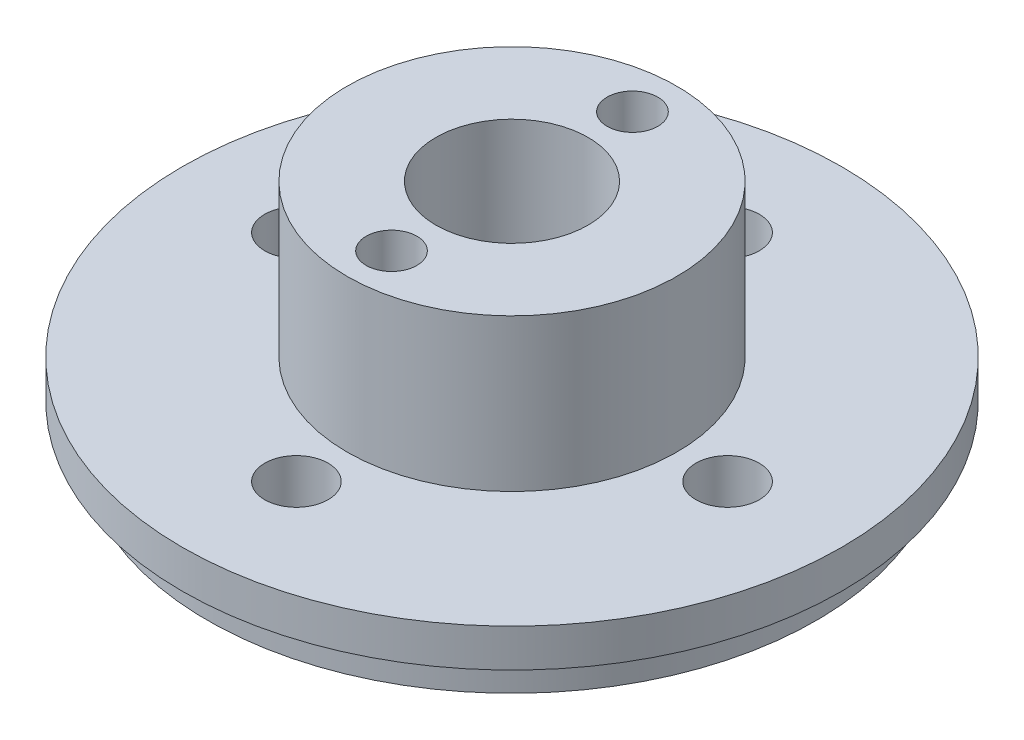
ISO-10303-21;
HEADER;
FILE_DESCRIPTION(('STEP AP214'),'2;1');
FILE_NAME('part.step','',(''),(''),'','','');
FILE_SCHEMA(('AUTOMOTIVE_DESIGN { 1 0 10303 214 1 1 1 1 }'));
ENDSEC;
DATA;
#1=APPLICATION_CONTEXT('core data for automotive mechanical design processes');
#2=APPLICATION_PROTOCOL_DEFINITION('international standard','automotive_design',2000,#1);
#3=PRODUCT_CONTEXT('',#1,'mechanical');
#4=PRODUCT('Part','Part','',(#3));
#5=PRODUCT_RELATED_PRODUCT_CATEGORY('part','',(#4));
#6=PRODUCT_DEFINITION_FORMATION('','',#4);
#7=PRODUCT_DEFINITION_CONTEXT('part definition',#1,'design');
#8=PRODUCT_DEFINITION('design','',#6,#7);
#9=PRODUCT_DEFINITION_SHAPE('','',#8);
#10=(LENGTH_UNIT() NAMED_UNIT(*) SI_UNIT(.MILLI.,.METRE.));
#11=(NAMED_UNIT(*) PLANE_ANGLE_UNIT() SI_UNIT($,.RADIAN.));
#12=(NAMED_UNIT(*) SI_UNIT($,.STERADIAN.) SOLID_ANGLE_UNIT());
#13=UNCERTAINTY_MEASURE_WITH_UNIT(LENGTH_MEASURE(1.E-05),#10,'distance_accuracy_value','');
#14=(GEOMETRIC_REPRESENTATION_CONTEXT(3) GLOBAL_UNCERTAINTY_ASSIGNED_CONTEXT((#13)) GLOBAL_UNIT_ASSIGNED_CONTEXT((#10,
#11,#12)) REPRESENTATION_CONTEXT('',''));
#15=CARTESIAN_POINT('',(0.,0.,0.));
#16=DIRECTION('',(0.,0.,1.));
#17=DIRECTION('',(1.,0.,0.));
#18=AXIS2_PLACEMENT_3D('',#15,#16,#17);
#19=CARTESIAN_POINT('',(0.,-2.3,0.));
#20=DIRECTION('',(0.,-1.,0.));
#21=DIRECTION('',(0.,0.,-1.));
#22=AXIS2_PLACEMENT_3D('',#19,#20,#21);
#23=PLANE('',#22);
#24=CARTESIAN_POINT('',(0.,-2.3,0.));
#25=DIRECTION('',(0.,-1.,0.));
#26=DIRECTION('',(0.,0.,-1.));
#27=AXIS2_PLACEMENT_3D('',#24,#25,#26);
#28=CIRCLE('',#27,2.);
#29=CARTESIAN_POINT('',(0.,-2.3,-2.));
#30=VERTEX_POINT('',#29);
#31=EDGE_CURVE('E128',#30,#30,#28,.T.);
#32=ORIENTED_EDGE('',*,*,#31,.F.);
#33=EDGE_LOOP('',(#32));
#34=FACE_BOUND('',#33,.T.);
#35=DIRECTION('',(-0.707106781186549,0.,-0.707106781186546));
#36=VECTOR('',#35,1.);
#37=CARTESIAN_POINT('',(-1.94454364826301,-2.3,1.94454364826302));
#38=LINE('',#37,#36);
#39=CARTESIAN_POINT('',(0.,-2.3,3.88908729652602));
#40=VERTEX_POINT('',#39);
#41=CARTESIAN_POINT('',(-3.88908729652601,-2.3,0.));
#42=VERTEX_POINT('',#41);
#43=EDGE_CURVE('E95',#40,#42,#38,.T.);
#44=ORIENTED_EDGE('',*,*,#43,.T.);
#45=DIRECTION('',(-0.707106781186546,0.,0.707106781186549));
#46=VECTOR('',#45,1.);
#47=CARTESIAN_POINT('',(-1.94454364826301,-2.3,-1.944543648263));
#48=LINE('',#47,#46);
#49=CARTESIAN_POINT('',(-6.10912646050242,-2.3,2.22003916397642));
#50=VERTEX_POINT('',#49);
#51=EDGE_CURVE('E86',#42,#50,#48,.T.);
#52=ORIENTED_EDGE('',*,*,#51,.T.);
#53=CARTESIAN_POINT('',(0.,-2.3,0.));
#54=DIRECTION('',(0.,-1.,0.));
#55=DIRECTION('',(0.,0.,-1.));
#56=AXIS2_PLACEMENT_3D('',#53,#54,#55);
#57=CIRCLE('',#56,6.5);
#58=CARTESIAN_POINT('',(-2.22003916397641,-2.3,6.10912646050243));
#59=VERTEX_POINT('',#58);
#60=EDGE_CURVE('E134',#50,#59,#57,.T.);
#61=ORIENTED_EDGE('',*,*,#60,.T.);
#62=DIRECTION('',(-0.707106781186546,0.,0.707106781186549));
#63=VECTOR('',#62,1.);
#64=CARTESIAN_POINT('',(1.94454364826301,-2.3,1.944543648263));
#65=LINE('',#64,#63);
#66=EDGE_CURVE('E114',#40,#59,#65,.T.);
#67=ORIENTED_EDGE('',*,*,#66,.F.);
#68=EDGE_LOOP('',(#44,#52,#61,#67));
#69=FACE_BOUND('',#68,.T.);
#70=ADVANCED_FACE('F44',(#34,#69),#23,.T.);
#71=CARTESIAN_POINT('',(0.,-2.3,0.));
#72=DIRECTION('',(0.,1.,0.));
#73=DIRECTION('',(0.,0.,1.));
#74=AXIS2_PLACEMENT_3D('',#71,#72,#73);
#75=CYLINDRICAL_SURFACE('',#74,6.5);
#76=DIRECTION('',(0.,-1.,0.));
#77=VECTOR('',#76,1.);
#78=CARTESIAN_POINT('',(-6.10912646050242,-1.5,2.22003916397642));
#79=LINE('',#78,#77);
#80=CARTESIAN_POINT('',(-6.10912646050242,-1.5,2.22003916397642));
#81=VERTEX_POINT('',#80);
#82=EDGE_CURVE('E123',#81,#50,#79,.T.);
#83=ORIENTED_EDGE('',*,*,#82,.F.);
#84=CARTESIAN_POINT('',(0.,-1.5,0.));
#85=DIRECTION('',(0.,-1.,0.));
#86=DIRECTION('',(0.,0.,-1.));
#87=AXIS2_PLACEMENT_3D('',#84,#85,#86);
#88=CIRCLE('',#87,6.5);
#89=CARTESIAN_POINT('',(-2.22003916397641,-1.5,6.10912646050243));
#90=VERTEX_POINT('',#89);
#91=EDGE_CURVE('E132',#81,#90,#88,.T.);
#92=ORIENTED_EDGE('',*,*,#91,.T.);
#93=DIRECTION('',(0.,-1.,0.));
#94=VECTOR('',#93,1.);
#95=CARTESIAN_POINT('',(-2.22003916397641,-1.5,6.10912646050243));
#96=LINE('',#95,#94);
#97=EDGE_CURVE('E99',#90,#59,#96,.T.);
#98=ORIENTED_EDGE('',*,*,#97,.T.);
#99=ORIENTED_EDGE('',*,*,#60,.F.);
#100=EDGE_LOOP('',(#83,#92,#98,#99));
#101=FACE_BOUND('',#100,.T.);
#102=ADVANCED_FACE('F222',(#101),#75,.T.);
#103=CARTESIAN_POINT('',(0.,-1.5,0.));
#104=DIRECTION('',(0.,-1.,0.));
#105=DIRECTION('',(0.,0.,-1.));
#106=AXIS2_PLACEMENT_3D('',#103,#104,#105);
#107=PLANE('',#106);
#108=CARTESIAN_POINT('',(8.5,-1.5,0.));
#109=DIRECTION('',(0.,-1.,0.));
#110=DIRECTION('',(0.,0.,-1.));
#111=AXIS2_PLACEMENT_3D('',#108,#109,#110);
#112=CIRCLE('',#111,1.25);
#113=CARTESIAN_POINT('',(8.5,-1.5,-1.25000000000006));
#114=VERTEX_POINT('',#113);
#115=EDGE_CURVE('E133',#114,#114,#112,.T.);
#116=ORIENTED_EDGE('',*,*,#115,.F.);
#117=EDGE_LOOP('',(#116));
#118=FACE_BOUND('',#117,.T.);
#119=CARTESIAN_POINT('',(2.93910671240954E-13,-1.5,8.50000000000023));
#120=DIRECTION('',(0.,-1.,0.));
#121=DIRECTION('',(0.,0.,-1.));
#122=AXIS2_PLACEMENT_3D('',#119,#120,#121);
#123=CIRCLE('',#122,1.2499999999997);
#124=CARTESIAN_POINT('',(2.93910671240954E-13,-1.5,7.25000000000054));
#125=VERTEX_POINT('',#124);
#126=EDGE_CURVE('E210',#125,#125,#123,.T.);
#127=ORIENTED_EDGE('',*,*,#126,.F.);
#128=EDGE_LOOP('',(#127));
#129=FACE_BOUND('',#128,.T.);
#130=CARTESIAN_POINT('',(-8.5,-1.5,5.28466159721575E-13));
#131=DIRECTION('',(0.,-1.,0.));
#132=DIRECTION('',(0.,0.,-1.));
#133=AXIS2_PLACEMENT_3D('',#130,#131,#132);
#134=CIRCLE('',#133,1.24999999999984);
#135=CARTESIAN_POINT('',(-8.5,-1.5,-1.24999999999932));
#136=VERTEX_POINT('',#135);
#137=EDGE_CURVE('E206',#136,#136,#134,.T.);
#138=ORIENTED_EDGE('',*,*,#137,.F.);
#139=EDGE_LOOP('',(#138));
#140=FACE_BOUND('',#139,.T.);
#141=CARTESIAN_POINT('',(-2.94951621020229E-13,-1.5,-8.49999999999977));
#142=DIRECTION('',(0.,-1.,0.));
#143=DIRECTION('',(0.,0.,-1.));
#144=AXIS2_PLACEMENT_3D('',#141,#142,#143);
#145=CIRCLE('',#144,1.25000000000013);
#146=CARTESIAN_POINT('',(-2.94951621020229E-13,-1.5,-9.74999999999989));
#147=VERTEX_POINT('',#146);
#148=EDGE_CURVE('E122',#147,#147,#145,.T.);
#149=ORIENTED_EDGE('',*,*,#148,.F.);
#150=EDGE_LOOP('',(#149));
#151=FACE_BOUND('',#150,.T.);
#152=CARTESIAN_POINT('',(0.,-1.5,0.));
#153=DIRECTION('',(0.,-1.,0.));
#154=DIRECTION('',(0.,0.,-1.));
#155=AXIS2_PLACEMENT_3D('',#152,#153,#154);
#156=CIRCLE('',#155,12.);
#157=CARTESIAN_POINT('',(0.,-1.5,-12.));
#158=VERTEX_POINT('',#157);
#159=EDGE_CURVE('E138',#158,#158,#156,.T.);
#160=ORIENTED_EDGE('',*,*,#159,.T.);
#161=EDGE_LOOP('',(#160));
#162=FACE_BOUND('',#161,.T.);
#163=ORIENTED_EDGE('',*,*,#91,.F.);
#164=DIRECTION('',(-0.707106781186546,0.,0.707106781186549));
#165=VECTOR('',#164,1.);
#166=CARTESIAN_POINT('',(-1.94454364826301,-1.5,-1.944543648263));
#167=LINE('',#166,#165);
#168=CARTESIAN_POINT('',(-3.88908729652601,-1.5,0.));
#169=VERTEX_POINT('',#168);
#170=EDGE_CURVE('E67',#169,#81,#167,.T.);
#171=ORIENTED_EDGE('',*,*,#170,.F.);
#172=DIRECTION('',(-0.707106781186549,0.,-0.707106781186546));
#173=VECTOR('',#172,1.);
#174=CARTESIAN_POINT('',(-1.94454364826301,-1.5,1.94454364826302));
#175=LINE('',#174,#173);
#176=CARTESIAN_POINT('',(0.,-1.5,3.88908729652602));
#177=VERTEX_POINT('',#176);
#178=EDGE_CURVE('E93',#177,#169,#175,.T.);
#179=ORIENTED_EDGE('',*,*,#178,.F.);
#180=DIRECTION('',(-0.707106781186546,0.,0.707106781186549));
#181=VECTOR('',#180,1.);
#182=CARTESIAN_POINT('',(1.94454364826301,-1.5,1.944543648263));
#183=LINE('',#182,#181);
#184=EDGE_CURVE('E61',#177,#90,#183,.T.);
#185=ORIENTED_EDGE('',*,*,#184,.T.);
#186=EDGE_LOOP('',(#163,#171,#179,#185));
#187=FACE_BOUND('',#186,.T.);
#188=ADVANCED_FACE('F101',(#118,#129,#140,#151,#162,#187),#107,.T.);
#189=CARTESIAN_POINT('',(0.,1.5,0.));
#190=DIRECTION('',(0.,-1.,0.));
#191=DIRECTION('',(0.,0.,-1.));
#192=AXIS2_PLACEMENT_3D('',#189,#190,#191);
#193=CYLINDRICAL_SURFACE('',#192,13.);
#194=CARTESIAN_POINT('',(0.,1.5,0.));
#195=DIRECTION('',(0.,1.,0.));
#196=DIRECTION('',(0.,0.,1.));
#197=AXIS2_PLACEMENT_3D('',#194,#195,#196);
#198=CIRCLE('',#197,13.);
#199=CARTESIAN_POINT('',(0.,1.5,13.));
#200=VERTEX_POINT('',#199);
#201=EDGE_CURVE('E196',#200,#200,#198,.T.);
#202=ORIENTED_EDGE('',*,*,#201,.F.);
#203=EDGE_LOOP('',(#202));
#204=FACE_BOUND('',#203,.T.);
#205=CARTESIAN_POINT('',(0.,0.,0.));
#206=DIRECTION('',(0.,1.,0.));
#207=DIRECTION('',(0.,0.,1.));
#208=AXIS2_PLACEMENT_3D('',#205,#206,#207);
#209=CIRCLE('',#208,13.);
#210=CARTESIAN_POINT('',(0.,0.,13.));
#211=VERTEX_POINT('',#210);
#212=EDGE_CURVE('E192',#211,#211,#209,.T.);
#213=ORIENTED_EDGE('',*,*,#212,.T.);
#214=EDGE_LOOP('',(#213));
#215=FACE_BOUND('',#214,.T.);
#216=ADVANCED_FACE('F221',(#204,#215),#193,.T.);
#217=CARTESIAN_POINT('',(0.,1.5,0.));
#218=DIRECTION('',(0.,1.,0.));
#219=DIRECTION('',(0.,0.,1.));
#220=AXIS2_PLACEMENT_3D('',#217,#218,#219);
#221=PLANE('',#220);
#222=CARTESIAN_POINT('',(-8.5,1.5,0.));
#223=DIRECTION('',(0.,1.,0.));
#224=DIRECTION('',(0.,0.,1.));
#225=AXIS2_PLACEMENT_3D('',#222,#223,#224);
#226=CIRCLE('',#225,1.25);
#227=CARTESIAN_POINT('',(-8.5,1.5,1.25));
#228=VERTEX_POINT('',#227);
#229=EDGE_CURVE('E176',#228,#228,#226,.T.);
#230=ORIENTED_EDGE('',*,*,#229,.F.);
#231=EDGE_LOOP('',(#230));
#232=FACE_BOUND('',#231,.T.);
#233=CARTESIAN_POINT('',(0.,1.5,8.5));
#234=DIRECTION('',(0.,1.,0.));
#235=DIRECTION('',(0.,0.,1.));
#236=AXIS2_PLACEMENT_3D('',#233,#234,#235);
#237=CIRCLE('',#236,1.25);
#238=CARTESIAN_POINT('',(0.,1.5,9.75));
#239=VERTEX_POINT('',#238);
#240=EDGE_CURVE('E172',#239,#239,#237,.T.);
#241=ORIENTED_EDGE('',*,*,#240,.F.);
#242=EDGE_LOOP('',(#241));
#243=FACE_BOUND('',#242,.T.);
#244=CARTESIAN_POINT('',(8.5,1.5,0.));
#245=DIRECTION('',(0.,1.,0.));
#246=DIRECTION('',(0.,0.,1.));
#247=AXIS2_PLACEMENT_3D('',#244,#245,#246);
#248=CIRCLE('',#247,1.25);
#249=CARTESIAN_POINT('',(8.5,1.5,1.24999999999994));
#250=VERTEX_POINT('',#249);
#251=EDGE_CURVE('E168',#250,#250,#248,.T.);
#252=ORIENTED_EDGE('',*,*,#251,.F.);
#253=EDGE_LOOP('',(#252));
#254=FACE_BOUND('',#253,.T.);
#255=CARTESIAN_POINT('',(0.,1.5,-8.5));
#256=DIRECTION('',(0.,1.,0.));
#257=DIRECTION('',(0.,0.,1.));
#258=AXIS2_PLACEMENT_3D('',#255,#256,#257);
#259=CIRCLE('',#258,1.25);
#260=CARTESIAN_POINT('',(0.,1.5,-7.25));
#261=VERTEX_POINT('',#260);
#262=EDGE_CURVE('E153',#261,#261,#259,.T.);
#263=ORIENTED_EDGE('',*,*,#262,.F.);
#264=EDGE_LOOP('',(#263));
#265=FACE_BOUND('',#264,.T.);
#266=CARTESIAN_POINT('',(0.,1.5,0.));
#267=DIRECTION('',(0.,1.,0.));
#268=DIRECTION('',(0.,0.,1.));
#269=AXIS2_PLACEMENT_3D('',#266,#267,#268);
#270=CIRCLE('',#269,6.5);
#271=CARTESIAN_POINT('',(0.,1.5,6.5));
#272=VERTEX_POINT('',#271);
#273=EDGE_CURVE('E148',#272,#272,#270,.T.);
#274=ORIENTED_EDGE('',*,*,#273,.F.);
#275=EDGE_LOOP('',(#274));
#276=FACE_BOUND('',#275,.T.);
#277=ORIENTED_EDGE('',*,*,#201,.T.);
#278=EDGE_LOOP('',(#277));
#279=FACE_BOUND('',#278,.T.);
#280=ADVANCED_FACE('F244',(#232,#243,#254,#265,#276,#279),#221,.T.);
#281=CARTESIAN_POINT('',(0.,0.,0.));
#282=DIRECTION('',(0.,1.,0.));
#283=DIRECTION('',(0.,0.,1.));
#284=AXIS2_PLACEMENT_3D('',#281,#282,#283);
#285=PLANE('',#284);
#286=CARTESIAN_POINT('',(0.,0.,0.));
#287=DIRECTION('',(0.,-1.,0.));
#288=DIRECTION('',(0.,0.,-1.));
#289=AXIS2_PLACEMENT_3D('',#286,#287,#288);
#290=CIRCLE('',#289,12.);
#291=CARTESIAN_POINT('',(0.,0.,-12.));
#292=VERTEX_POINT('',#291);
#293=EDGE_CURVE('E54',#292,#292,#290,.T.);
#294=ORIENTED_EDGE('',*,*,#293,.F.);
#295=EDGE_LOOP('',(#294));
#296=FACE_BOUND('',#295,.T.);
#297=ORIENTED_EDGE('',*,*,#212,.F.);
#298=EDGE_LOOP('',(#297));
#299=FACE_BOUND('',#298,.T.);
#300=ADVANCED_FACE('F240',(#296,#299),#285,.F.);
#301=CARTESIAN_POINT('',(0.,7.5,0.));
#302=DIRECTION('',(0.,-1.,0.));
#303=DIRECTION('',(0.,0.,-1.));
#304=AXIS2_PLACEMENT_3D('',#301,#302,#303);
#305=CYLINDRICAL_SURFACE('',#304,6.5);
#306=CARTESIAN_POINT('',(0.,7.5,0.));
#307=DIRECTION('',(0.,1.,0.));
#308=DIRECTION('',(0.,0.,1.));
#309=AXIS2_PLACEMENT_3D('',#306,#307,#308);
#310=CIRCLE('',#309,6.5);
#311=CARTESIAN_POINT('',(0.,7.5,6.5));
#312=VERTEX_POINT('',#311);
#313=EDGE_CURVE('E185',#312,#312,#310,.T.);
#314=ORIENTED_EDGE('',*,*,#313,.F.);
#315=EDGE_LOOP('',(#314));
#316=FACE_BOUND('',#315,.T.);
#317=ORIENTED_EDGE('',*,*,#273,.T.);
#318=EDGE_LOOP('',(#317));
#319=FACE_BOUND('',#318,.T.);
#320=ADVANCED_FACE('F243',(#316,#319),#305,.T.);
#321=CARTESIAN_POINT('',(0.,7.5,0.));
#322=DIRECTION('',(0.,1.,0.));
#323=DIRECTION('',(0.,0.,1.));
#324=AXIS2_PLACEMENT_3D('',#321,#322,#323);
#325=PLANE('',#324);
#326=CARTESIAN_POINT('',(0.,7.5,-4.75));
#327=DIRECTION('',(0.,1.,0.));
#328=DIRECTION('',(0.,0.,1.));
#329=AXIS2_PLACEMENT_3D('',#326,#327,#328);
#330=CIRCLE('',#329,1.);
#331=CARTESIAN_POINT('',(0.,7.5,-3.75));
#332=VERTEX_POINT('',#331);
#333=EDGE_CURVE('E154',#332,#332,#330,.T.);
#334=ORIENTED_EDGE('',*,*,#333,.F.);
#335=EDGE_LOOP('',(#334));
#336=FACE_BOUND('',#335,.T.);
#337=CARTESIAN_POINT('',(0.,7.5,4.75));
#338=DIRECTION('',(0.,1.,0.));
#339=DIRECTION('',(0.,0.,1.));
#340=AXIS2_PLACEMENT_3D('',#337,#338,#339);
#341=CIRCLE('',#340,1.);
#342=CARTESIAN_POINT('',(0.,7.5,5.75));
#343=VERTEX_POINT('',#342);
#344=EDGE_CURVE('E158',#343,#343,#341,.T.);
#345=ORIENTED_EDGE('',*,*,#344,.F.);
#346=EDGE_LOOP('',(#345));
#347=FACE_BOUND('',#346,.T.);
#348=CARTESIAN_POINT('',(0.,7.5,0.));
#349=DIRECTION('',(0.,1.,0.));
#350=DIRECTION('',(0.,0.,1.));
#351=AXIS2_PLACEMENT_3D('',#348,#349,#350);
#352=CIRCLE('',#351,3.);
#353=CARTESIAN_POINT('',(0.,7.5,3.));
#354=VERTEX_POINT('',#353);
#355=EDGE_CURVE('E180',#354,#354,#352,.T.);
#356=ORIENTED_EDGE('',*,*,#355,.F.);
#357=EDGE_LOOP('',(#356));
#358=FACE_BOUND('',#357,.T.);
#359=ORIENTED_EDGE('',*,*,#313,.T.);
#360=EDGE_LOOP('',(#359));
#361=FACE_BOUND('',#360,.T.);
#362=ADVANCED_FACE('F306',(#336,#347,#358,#361),#325,.T.);
#363=CARTESIAN_POINT('',(0.,1.5,0.));
#364=DIRECTION('',(0.,1.,0.));
#365=DIRECTION('',(0.,0.,1.));
#366=AXIS2_PLACEMENT_3D('',#363,#364,#365);
#367=CYLINDRICAL_SURFACE('',#366,3.);
#368=CARTESIAN_POINT('',(0.,1.5,0.));
#369=DIRECTION('',(0.,1.,0.));
#370=DIRECTION('',(0.,0.,1.));
#371=AXIS2_PLACEMENT_3D('',#368,#369,#370);
#372=CIRCLE('',#371,3.);
#373=CARTESIAN_POINT('',(0.,1.5,3.));
#374=VERTEX_POINT('',#373);
#375=EDGE_CURVE('E181',#374,#374,#372,.T.);
#376=ORIENTED_EDGE('',*,*,#375,.F.);
#377=EDGE_LOOP('',(#376));
#378=FACE_BOUND('',#377,.T.);
#379=ORIENTED_EDGE('',*,*,#355,.T.);
#380=EDGE_LOOP('',(#379));
#381=FACE_BOUND('',#380,.T.);
#382=ADVANCED_FACE('F302',(#378,#381),#367,.F.);
#383=CARTESIAN_POINT('',(0.,8.,-8.5));
#384=DIRECTION('',(0.,-1.,0.));
#385=DIRECTION('',(0.,0.,-1.));
#386=AXIS2_PLACEMENT_3D('',#383,#384,#385);
#387=CYLINDRICAL_SURFACE('',#386,1.25);
#388=ORIENTED_EDGE('',*,*,#262,.T.);
#389=EDGE_LOOP('',(#388));
#390=FACE_BOUND('',#389,.T.);
#391=ORIENTED_EDGE('',*,*,#148,.T.);
#392=EDGE_LOOP('',(#391));
#393=FACE_BOUND('',#392,.T.);
#394=ADVANCED_FACE('F298',(#390,#393),#387,.F.);
#395=CARTESIAN_POINT('',(8.5,8.,0.));
#396=DIRECTION('',(0.,-1.,0.));
#397=DIRECTION('',(0.,0.,-1.));
#398=AXIS2_PLACEMENT_3D('',#395,#396,#397);
#399=CYLINDRICAL_SURFACE('',#398,1.25);
#400=ORIENTED_EDGE('',*,*,#251,.T.);
#401=EDGE_LOOP('',(#400));
#402=FACE_BOUND('',#401,.T.);
#403=ORIENTED_EDGE('',*,*,#115,.T.);
#404=EDGE_LOOP('',(#403));
#405=FACE_BOUND('',#404,.T.);
#406=ADVANCED_FACE('F217',(#402,#405),#399,.F.);
#407=CARTESIAN_POINT('',(0.,8.,8.5));
#408=DIRECTION('',(0.,-1.,0.));
#409=DIRECTION('',(0.,0.,-1.));
#410=AXIS2_PLACEMENT_3D('',#407,#408,#409);
#411=CYLINDRICAL_SURFACE('',#410,1.25);
#412=ORIENTED_EDGE('',*,*,#240,.T.);
#413=EDGE_LOOP('',(#412));
#414=FACE_BOUND('',#413,.T.);
#415=ORIENTED_EDGE('',*,*,#126,.T.);
#416=EDGE_LOOP('',(#415));
#417=FACE_BOUND('',#416,.T.);
#418=ADVANCED_FACE('F291',(#414,#417),#411,.F.);
#419=CARTESIAN_POINT('',(-8.5,8.,0.));
#420=DIRECTION('',(0.,-1.,0.));
#421=DIRECTION('',(0.,0.,-1.));
#422=AXIS2_PLACEMENT_3D('',#419,#420,#421);
#423=CYLINDRICAL_SURFACE('',#422,1.25);
#424=ORIENTED_EDGE('',*,*,#229,.T.);
#425=EDGE_LOOP('',(#424));
#426=FACE_BOUND('',#425,.T.);
#427=ORIENTED_EDGE('',*,*,#137,.T.);
#428=EDGE_LOOP('',(#427));
#429=FACE_BOUND('',#428,.T.);
#430=ADVANCED_FACE('F284',(#426,#429),#423,.F.);
#431=CARTESIAN_POINT('',(0.,1.5,4.75));
#432=DIRECTION('',(0.,1.,0.));
#433=DIRECTION('',(0.,0.,1.));
#434=AXIS2_PLACEMENT_3D('',#431,#432,#433);
#435=CYLINDRICAL_SURFACE('',#434,1.);
#436=CARTESIAN_POINT('',(0.,1.5,4.75));
#437=DIRECTION('',(0.,1.,0.));
#438=DIRECTION('',(0.,0.,1.));
#439=AXIS2_PLACEMENT_3D('',#436,#437,#438);
#440=CIRCLE('',#439,1.);
#441=CARTESIAN_POINT('',(0.,1.5,5.75));
#442=VERTEX_POINT('',#441);
#443=EDGE_CURVE('E144',#442,#442,#440,.T.);
#444=ORIENTED_EDGE('',*,*,#443,.F.);
#445=EDGE_LOOP('',(#444));
#446=FACE_BOUND('',#445,.T.);
#447=ORIENTED_EDGE('',*,*,#344,.T.);
#448=EDGE_LOOP('',(#447));
#449=FACE_BOUND('',#448,.T.);
#450=ADVANCED_FACE('F281',(#446,#449),#435,.F.);
#451=CARTESIAN_POINT('',(0.,1.5,4.75));
#452=DIRECTION('',(0.,1.,0.));
#453=DIRECTION('',(0.,0.,1.));
#454=AXIS2_PLACEMENT_3D('',#451,#452,#453);
#455=PLANE('',#454);
#456=ORIENTED_EDGE('',*,*,#443,.T.);
#457=EDGE_LOOP('',(#456));
#458=FACE_BOUND('',#457,.T.);
#459=ADVANCED_FACE('F279',(#458),#455,.T.);
#460=CARTESIAN_POINT('',(0.,1.5,-4.75));
#461=DIRECTION('',(0.,1.,0.));
#462=DIRECTION('',(0.,0.,1.));
#463=AXIS2_PLACEMENT_3D('',#460,#461,#462);
#464=CYLINDRICAL_SURFACE('',#463,1.);
#465=CARTESIAN_POINT('',(0.,1.5,-4.75));
#466=DIRECTION('',(0.,1.,0.));
#467=DIRECTION('',(0.,0.,1.));
#468=AXIS2_PLACEMENT_3D('',#465,#466,#467);
#469=CIRCLE('',#468,1.);
#470=CARTESIAN_POINT('',(0.,1.5,-3.75));
#471=VERTEX_POINT('',#470);
#472=EDGE_CURVE('E149',#471,#471,#469,.T.);
#473=ORIENTED_EDGE('',*,*,#472,.F.);
#474=EDGE_LOOP('',(#473));
#475=FACE_BOUND('',#474,.T.);
#476=ORIENTED_EDGE('',*,*,#333,.T.);
#477=EDGE_LOOP('',(#476));
#478=FACE_BOUND('',#477,.T.);
#479=ADVANCED_FACE('F275',(#475,#478),#464,.F.);
#480=CARTESIAN_POINT('',(0.,1.5,-4.75));
#481=DIRECTION('',(0.,1.,0.));
#482=DIRECTION('',(0.,0.,1.));
#483=AXIS2_PLACEMENT_3D('',#480,#481,#482);
#484=PLANE('',#483);
#485=ORIENTED_EDGE('',*,*,#472,.T.);
#486=EDGE_LOOP('',(#485));
#487=FACE_BOUND('',#486,.T.);
#488=ADVANCED_FACE('F236',(#487),#484,.T.);
#489=CARTESIAN_POINT('',(0.,-1.5,0.));
#490=DIRECTION('',(0.,1.,0.));
#491=DIRECTION('',(0.,0.,1.));
#492=AXIS2_PLACEMENT_3D('',#489,#490,#491);
#493=CYLINDRICAL_SURFACE('',#492,12.);
#494=ORIENTED_EDGE('',*,*,#159,.F.);
#495=EDGE_LOOP('',(#494));
#496=FACE_BOUND('',#495,.T.);
#497=ORIENTED_EDGE('',*,*,#293,.T.);
#498=EDGE_LOOP('',(#497));
#499=FACE_BOUND('',#498,.T.);
#500=ADVANCED_FACE('F232',(#496,#499),#493,.T.);
#501=CARTESIAN_POINT('',(0.,-1.5,0.));
#502=DIRECTION('',(0.,1.,0.));
#503=DIRECTION('',(0.,0.,1.));
#504=AXIS2_PLACEMENT_3D('',#501,#502,#503);
#505=CYLINDRICAL_SURFACE('',#504,2.);
#506=CARTESIAN_POINT('',(0.,0.5,0.));
#507=DIRECTION('',(0.,1.,0.));
#508=DIRECTION('',(0.,0.,1.));
#509=AXIS2_PLACEMENT_3D('',#506,#507,#508);
#510=CIRCLE('',#509,2.);
#511=CARTESIAN_POINT('',(0.,0.5,2.));
#512=VERTEX_POINT('',#511);
#513=EDGE_CURVE('E11',#512,#512,#510,.T.);
#514=ORIENTED_EDGE('',*,*,#513,.T.);
#515=EDGE_LOOP('',(#514));
#516=FACE_BOUND('',#515,.T.);
#517=ORIENTED_EDGE('',*,*,#31,.T.);
#518=EDGE_LOOP('',(#517));
#519=FACE_BOUND('',#518,.T.);
#520=ADVANCED_FACE('F235',(#516,#519),#505,.F.);
#521=CARTESIAN_POINT('',(-1.94454364826301,-1.5,1.94454364826302));
#522=DIRECTION('',(-0.707106781186546,0.,0.707106781186549));
#523=DIRECTION('',(0.707106781186549,0.,0.707106781186546));
#524=AXIS2_PLACEMENT_3D('',#521,#522,#523);
#525=PLANE('',#524);
#526=ORIENTED_EDGE('',*,*,#43,.F.);
#527=DIRECTION('',(0.,-1.,0.));
#528=VECTOR('',#527,1.);
#529=CARTESIAN_POINT('',(0.,-1.5,3.88908729652602));
#530=LINE('',#529,#528);
#531=EDGE_CURVE('E91',#177,#40,#530,.T.);
#532=ORIENTED_EDGE('',*,*,#531,.F.);
#533=ORIENTED_EDGE('',*,*,#178,.T.);
#534=DIRECTION('',(0.,-1.,0.));
#535=VECTOR('',#534,1.);
#536=CARTESIAN_POINT('',(-3.88908729652601,-1.5,0.));
#537=LINE('',#536,#535);
#538=EDGE_CURVE('E119',#169,#42,#537,.T.);
#539=ORIENTED_EDGE('',*,*,#538,.T.);
#540=EDGE_LOOP('',(#526,#532,#533,#539));
#541=FACE_BOUND('',#540,.T.);
#542=ADVANCED_FACE('F92',(#541),#525,.T.);
#543=CARTESIAN_POINT('',(-1.94454364826301,-1.5,-1.944543648263));
#544=DIRECTION('',(0.707106781186549,0.,0.707106781186546));
#545=DIRECTION('',(0.707106781186546,0.,-0.707106781186549));
#546=AXIS2_PLACEMENT_3D('',#543,#544,#545);
#547=PLANE('',#546);
#548=ORIENTED_EDGE('',*,*,#51,.F.);
#549=ORIENTED_EDGE('',*,*,#538,.F.);
#550=ORIENTED_EDGE('',*,*,#170,.T.);
#551=ORIENTED_EDGE('',*,*,#82,.T.);
#552=EDGE_LOOP('',(#548,#549,#550,#551));
#553=FACE_BOUND('',#552,.T.);
#554=ADVANCED_FACE('F398',(#553),#547,.T.);
#555=CARTESIAN_POINT('',(1.94454364826301,-1.5,1.944543648263));
#556=DIRECTION('',(0.707106781186549,0.,0.707106781186546));
#557=DIRECTION('',(0.707106781186546,0.,-0.707106781186549));
#558=AXIS2_PLACEMENT_3D('',#555,#556,#557);
#559=PLANE('',#558);
#560=ORIENTED_EDGE('',*,*,#66,.T.);
#561=ORIENTED_EDGE('',*,*,#97,.F.);
#562=ORIENTED_EDGE('',*,*,#184,.F.);
#563=ORIENTED_EDGE('',*,*,#531,.T.);
#564=EDGE_LOOP('',(#560,#561,#562,#563));
#565=FACE_BOUND('',#564,.T.);
#566=ADVANCED_FACE('F104',(#565),#559,.F.);
#567=CARTESIAN_POINT('',(0.,0.5,0.));
#568=DIRECTION('',(0.,1.,0.));
#569=DIRECTION('',(0.,0.,1.));
#570=AXIS2_PLACEMENT_3D('',#567,#568,#569);
#571=CONICAL_SURFACE('',#570,2.,0.785398163397452);
#572=ORIENTED_EDGE('',*,*,#375,.T.);
#573=EDGE_LOOP('',(#572));
#574=FACE_BOUND('',#573,.T.);
#575=ORIENTED_EDGE('',*,*,#513,.F.);
#576=EDGE_LOOP('',(#575));
#577=FACE_BOUND('',#576,.T.);
#578=ADVANCED_FACE('F47',(#574,#577),#571,.F.);
#579=CLOSED_SHELL('',(#70,#102,#188,#216,#280,#300,#320,#362,#382,#394,#406,#418,#430,#450,#459,
#479,#488,#500,#520,#542,#554,#566,#578));
#580=MANIFOLD_SOLID_BREP('B2',#579);
#581=ADVANCED_BREP_SHAPE_REPRESENTATION('',(#18,#580),#14);
#582=SHAPE_DEFINITION_REPRESENTATION(#9,#581);
ENDSEC;
END-ISO-10303-21;
